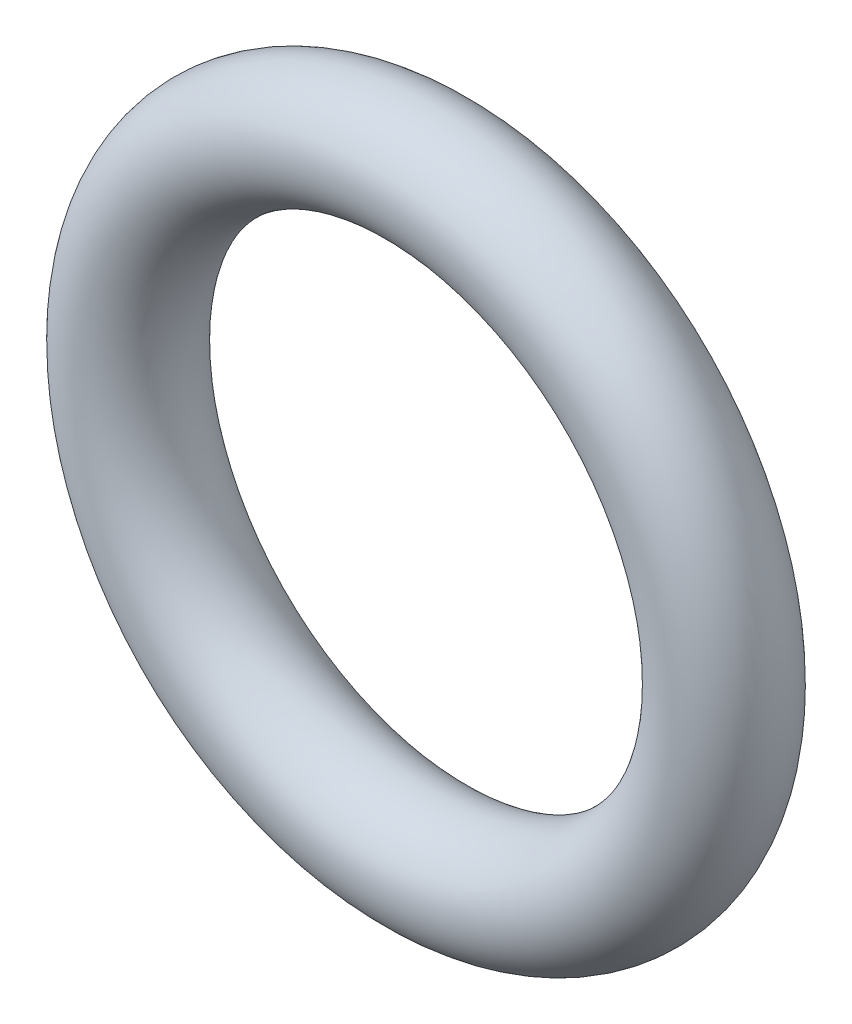
ISO-10303-21;
HEADER;
FILE_DESCRIPTION(('STEP AP214'),'2;1');
FILE_NAME('part.step','',(''),(''),'','','');
FILE_SCHEMA(('AUTOMOTIVE_DESIGN { 1 0 10303 214 1 1 1 1 }'));
ENDSEC;
DATA;
#1=APPLICATION_CONTEXT('core data for automotive mechanical design processes');
#2=APPLICATION_PROTOCOL_DEFINITION('international standard','automotive_design',2000,#1);
#3=PRODUCT_CONTEXT('',#1,'mechanical');
#4=PRODUCT('Part','Part','',(#3));
#5=PRODUCT_RELATED_PRODUCT_CATEGORY('part','',(#4));
#6=PRODUCT_DEFINITION_FORMATION('','',#4);
#7=PRODUCT_DEFINITION_CONTEXT('part definition',#1,'design');
#8=PRODUCT_DEFINITION('design','',#6,#7);
#9=PRODUCT_DEFINITION_SHAPE('','',#8);
#10=(LENGTH_UNIT() NAMED_UNIT(*) SI_UNIT(.MILLI.,.METRE.));
#11=(NAMED_UNIT(*) PLANE_ANGLE_UNIT() SI_UNIT($,.RADIAN.));
#12=(NAMED_UNIT(*) SI_UNIT($,.STERADIAN.) SOLID_ANGLE_UNIT());
#13=UNCERTAINTY_MEASURE_WITH_UNIT(LENGTH_MEASURE(1.E-05),#10,'distance_accuracy_value','');
#14=(GEOMETRIC_REPRESENTATION_CONTEXT(3) GLOBAL_UNCERTAINTY_ASSIGNED_CONTEXT((#13)) GLOBAL_UNIT_ASSIGNED_CONTEXT((#10,
#11,#12)) REPRESENTATION_CONTEXT('',''));
#15=CARTESIAN_POINT('',(0.,0.,0.));
#16=DIRECTION('',(0.,0.,1.));
#17=DIRECTION('',(1.,0.,0.));
#18=AXIS2_PLACEMENT_3D('',#15,#16,#17);
#19=CARTESIAN_POINT('',(0.,0.,0.));
#20=DIRECTION('',(0.,0.,-1.));
#21=DIRECTION('',(-1.,0.,0.));
#22=AXIS2_PLACEMENT_3D('',#19,#20,#21);
#23=TOROIDAL_SURFACE('',#22,4.65,0.9);
#24=CARTESIAN_POINT('',(-5.55,0.,0.));
#25=VERTEX_POINT('',#24);
#26=VERTEX_LOOP('',#25);
#27=FACE_BOUND('',#26,.T.);
#28=ADVANCED_FACE('F28',(#27),#23,.T.);
#29=CLOSED_SHELL('',(#28));
#30=MANIFOLD_SOLID_BREP('B2',#29);
#31=ADVANCED_BREP_SHAPE_REPRESENTATION('',(#18,#30),#14);
#32=SHAPE_DEFINITION_REPRESENTATION(#9,#31);
ENDSEC;
END-ISO-10303-21;
